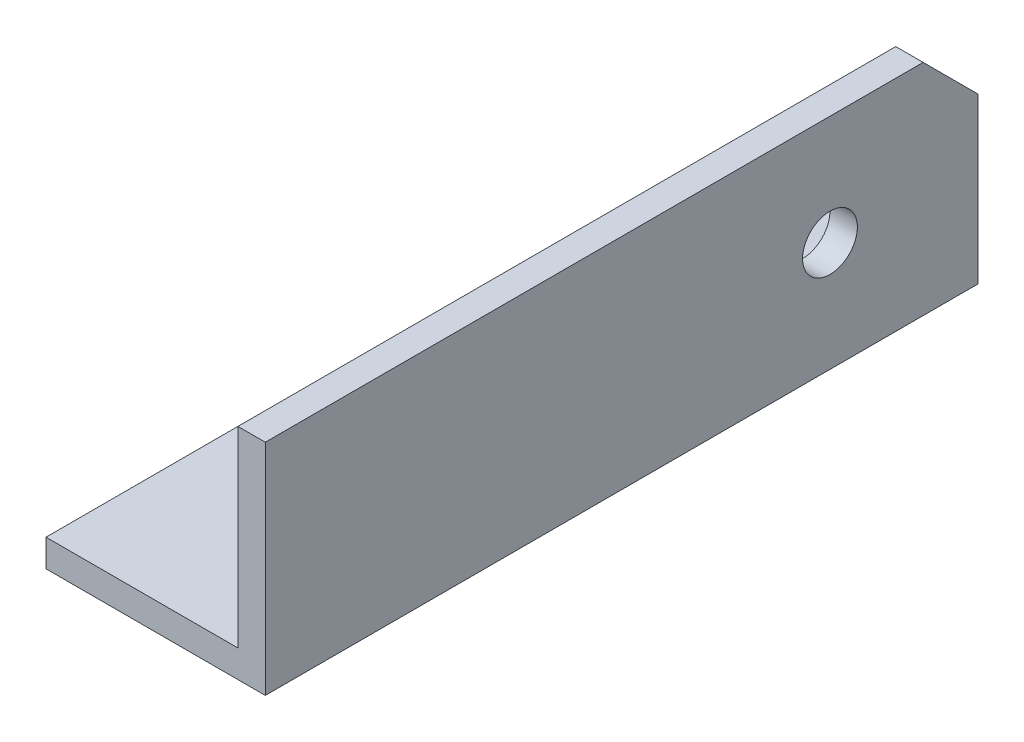
ISO-10303-21;
HEADER;
FILE_DESCRIPTION(('STEP AP214'),'2;1');
FILE_NAME('part.step','',(''),(''),'','','');
FILE_SCHEMA(('AUTOMOTIVE_DESIGN { 1 0 10303 214 1 1 1 1 }'));
ENDSEC;
DATA;
#1=APPLICATION_CONTEXT('core data for automotive mechanical design processes');
#2=APPLICATION_PROTOCOL_DEFINITION('international standard','automotive_design',2000,#1);
#3=PRODUCT_CONTEXT('',#1,'mechanical');
#4=PRODUCT('Part','Part','',(#3));
#5=PRODUCT_RELATED_PRODUCT_CATEGORY('part','',(#4));
#6=PRODUCT_DEFINITION_FORMATION('','',#4);
#7=PRODUCT_DEFINITION_CONTEXT('part definition',#1,'design');
#8=PRODUCT_DEFINITION('design','',#6,#7);
#9=PRODUCT_DEFINITION_SHAPE('','',#8);
#10=(LENGTH_UNIT() NAMED_UNIT(*) SI_UNIT(.MILLI.,.METRE.));
#11=(NAMED_UNIT(*) PLANE_ANGLE_UNIT() SI_UNIT($,.RADIAN.));
#12=(NAMED_UNIT(*) SI_UNIT($,.STERADIAN.) SOLID_ANGLE_UNIT());
#13=UNCERTAINTY_MEASURE_WITH_UNIT(LENGTH_MEASURE(1.E-05),#10,'distance_accuracy_value','');
#14=(GEOMETRIC_REPRESENTATION_CONTEXT(3) GLOBAL_UNCERTAINTY_ASSIGNED_CONTEXT((#13)) GLOBAL_UNIT_ASSIGNED_CONTEXT((#10,
#11,#12)) REPRESENTATION_CONTEXT('',''));
#15=CARTESIAN_POINT('',(0.,0.,0.));
#16=DIRECTION('',(0.,0.,1.));
#17=DIRECTION('',(1.,0.,0.));
#18=AXIS2_PLACEMENT_3D('',#15,#16,#17);
#19=CARTESIAN_POINT('',(0.,0.,-65.));
#20=DIRECTION('',(1.,0.,0.));
#21=DIRECTION('',(0.,0.,-1.));
#22=AXIS2_PLACEMENT_3D('',#19,#20,#21);
#23=PLANE('',#22);
#24=CARTESIAN_POINT('',(0.,20.,-38.));
#25=DIRECTION('',(1.,0.,0.));
#26=DIRECTION('',(0.,0.,-1.));
#27=AXIS2_PLACEMENT_3D('',#24,#25,#26);
#28=CIRCLE('',#27,5.);
#29=CARTESIAN_POINT('',(0.,20.,-43.));
#30=VERTEX_POINT('',#29);
#31=EDGE_CURVE('E112',#30,#30,#28,.T.);
#32=ORIENTED_EDGE('',*,*,#31,.F.);
#33=EDGE_LOOP('',(#32));
#34=FACE_BOUND('',#33,.T.);
#35=DIRECTION('',(0.,1.,0.));
#36=VECTOR('',#35,1.);
#37=CARTESIAN_POINT('',(0.,0.,-65.));
#38=LINE('',#37,#36);
#39=CARTESIAN_POINT('',(0.,0.,-65.));
#40=VERTEX_POINT('',#39);
#41=CARTESIAN_POINT('',(0.,30.,-65.));
#42=VERTEX_POINT('',#41);
#43=EDGE_CURVE('E127',#40,#42,#38,.T.);
#44=ORIENTED_EDGE('',*,*,#43,.T.);
#45=DIRECTION('',(0.,0.707106781186547,0.707106781186548));
#46=VECTOR('',#45,1.);
#47=CARTESIAN_POINT('',(0.,15.,-80.));
#48=LINE('',#47,#46);
#49=CARTESIAN_POINT('',(0.,40.,-55.));
#50=VERTEX_POINT('',#49);
#51=EDGE_CURVE('E55',#42,#50,#48,.T.);
#52=ORIENTED_EDGE('',*,*,#51,.T.);
#53=DIRECTION('',(0.,0.,1.));
#54=VECTOR('',#53,1.);
#55=CARTESIAN_POINT('',(0.,40.,-65.));
#56=LINE('',#55,#54);
#57=CARTESIAN_POINT('',(0.,40.,65.));
#58=VERTEX_POINT('',#57);
#59=EDGE_CURVE('E94',#50,#58,#56,.T.);
#60=ORIENTED_EDGE('',*,*,#59,.T.);
#61=DIRECTION('',(0.,1.,0.));
#62=VECTOR('',#61,1.);
#63=CARTESIAN_POINT('',(0.,0.,65.));
#64=LINE('',#63,#62);
#65=CARTESIAN_POINT('',(0.,0.,65.));
#66=VERTEX_POINT('',#65);
#67=EDGE_CURVE('E97',#66,#58,#64,.T.);
#68=ORIENTED_EDGE('',*,*,#67,.F.);
#69=DIRECTION('',(0.,0.,1.));
#70=VECTOR('',#69,1.);
#71=CARTESIAN_POINT('',(0.,0.,-65.));
#72=LINE('',#71,#70);
#73=EDGE_CURVE('E135',#40,#66,#72,.T.);
#74=ORIENTED_EDGE('',*,*,#73,.F.);
#75=EDGE_LOOP('',(#44,#52,#60,#68,#74));
#76=FACE_BOUND('',#75,.T.);
#77=ADVANCED_FACE('F33',(#34,#76),#23,.T.);
#78=CARTESIAN_POINT('',(-40.,0.,-65.));
#79=DIRECTION('',(0.,-1.,0.));
#80=DIRECTION('',(0.,0.,-1.));
#81=AXIS2_PLACEMENT_3D('',#78,#79,#80);
#82=PLANE('',#81);
#83=DIRECTION('',(0.,0.,1.));
#84=VECTOR('',#83,1.);
#85=CARTESIAN_POINT('',(-40.,0.,-65.));
#86=LINE('',#85,#84);
#87=CARTESIAN_POINT('',(-40.,0.,-55.));
#88=VERTEX_POINT('',#87);
#89=CARTESIAN_POINT('',(-40.,0.,65.));
#90=VERTEX_POINT('',#89);
#91=EDGE_CURVE('E138',#88,#90,#86,.T.);
#92=ORIENTED_EDGE('',*,*,#91,.F.);
#93=DIRECTION('',(0.707106781186547,0.,-0.707106781186548));
#94=VECTOR('',#93,1.);
#95=CARTESIAN_POINT('',(-35.,0.,-60.));
#96=LINE('',#95,#94);
#97=CARTESIAN_POINT('',(-30.,0.,-65.));
#98=VERTEX_POINT('',#97);
#99=EDGE_CURVE('E154',#88,#98,#96,.T.);
#100=ORIENTED_EDGE('',*,*,#99,.T.);
#101=DIRECTION('',(1.,0.,0.));
#102=VECTOR('',#101,1.);
#103=CARTESIAN_POINT('',(-40.,0.,-65.));
#104=LINE('',#103,#102);
#105=EDGE_CURVE('E100',#98,#40,#104,.T.);
#106=ORIENTED_EDGE('',*,*,#105,.T.);
#107=ORIENTED_EDGE('',*,*,#73,.T.);
#108=DIRECTION('',(1.,0.,0.));
#109=VECTOR('',#108,1.);
#110=CARTESIAN_POINT('',(-40.,0.,65.));
#111=LINE('',#110,#109);
#112=EDGE_CURVE('E111',#90,#66,#111,.T.);
#113=ORIENTED_EDGE('',*,*,#112,.F.);
#114=EDGE_LOOP('',(#92,#100,#106,#107,#113));
#115=FACE_BOUND('',#114,.T.);
#116=ADVANCED_FACE('F160',(#115),#82,.T.);
#117=CARTESIAN_POINT('',(-40.,0.,-65.));
#118=DIRECTION('',(1.,0.,0.));
#119=DIRECTION('',(0.,0.,-1.));
#120=AXIS2_PLACEMENT_3D('',#117,#118,#119);
#121=PLANE('',#120);
#122=DIRECTION('',(0.,0.,1.));
#123=VECTOR('',#122,1.);
#124=CARTESIAN_POINT('',(-40.,5.,-65.));
#125=LINE('',#124,#123);
#126=CARTESIAN_POINT('',(-40.,5.,-55.));
#127=VERTEX_POINT('',#126);
#128=CARTESIAN_POINT('',(-40.,5.,65.));
#129=VERTEX_POINT('',#128);
#130=EDGE_CURVE('E140',#127,#129,#125,.T.);
#131=ORIENTED_EDGE('',*,*,#130,.F.);
#132=DIRECTION('',(0.,-1.,0.));
#133=VECTOR('',#132,1.);
#134=CARTESIAN_POINT('',(-40.,0.,-55.));
#135=LINE('',#134,#133);
#136=EDGE_CURVE('E152',#127,#88,#135,.T.);
#137=ORIENTED_EDGE('',*,*,#136,.T.);
#138=ORIENTED_EDGE('',*,*,#91,.T.);
#139=DIRECTION('',(0.,1.,0.));
#140=VECTOR('',#139,1.);
#141=CARTESIAN_POINT('',(-40.,0.,65.));
#142=LINE('',#141,#140);
#143=EDGE_CURVE('E123',#90,#129,#142,.T.);
#144=ORIENTED_EDGE('',*,*,#143,.T.);
#145=EDGE_LOOP('',(#131,#137,#138,#144));
#146=FACE_BOUND('',#145,.T.);
#147=ADVANCED_FACE('F175',(#146),#121,.F.);
#148=CARTESIAN_POINT('',(-40.,5.,-65.));
#149=DIRECTION('',(0.,-1.,0.));
#150=DIRECTION('',(0.,0.,-1.));
#151=AXIS2_PLACEMENT_3D('',#148,#149,#150);
#152=PLANE('',#151);
#153=DIRECTION('',(1.,0.,0.));
#154=VECTOR('',#153,1.);
#155=CARTESIAN_POINT('',(-40.,5.,-65.));
#156=LINE('',#155,#154);
#157=CARTESIAN_POINT('',(-30.,5.,-65.));
#158=VERTEX_POINT('',#157);
#159=CARTESIAN_POINT('',(-5.,5.,-65.));
#160=VERTEX_POINT('',#159);
#161=EDGE_CURVE('E132',#158,#160,#156,.T.);
#162=ORIENTED_EDGE('',*,*,#161,.F.);
#163=DIRECTION('',(-0.707106781186547,0.,0.707106781186548));
#164=VECTOR('',#163,1.);
#165=CARTESIAN_POINT('',(-30.,5.,-65.));
#166=LINE('',#165,#164);
#167=EDGE_CURVE('E150',#158,#127,#166,.T.);
#168=ORIENTED_EDGE('',*,*,#167,.T.);
#169=ORIENTED_EDGE('',*,*,#130,.T.);
#170=DIRECTION('',(1.,0.,0.));
#171=VECTOR('',#170,1.);
#172=CARTESIAN_POINT('',(-40.,5.,65.));
#173=LINE('',#172,#171);
#174=CARTESIAN_POINT('',(-5.,5.,65.));
#175=VERTEX_POINT('',#174);
#176=EDGE_CURVE('E117',#129,#175,#173,.T.);
#177=ORIENTED_EDGE('',*,*,#176,.T.);
#178=DIRECTION('',(0.,0.,1.));
#179=VECTOR('',#178,1.);
#180=CARTESIAN_POINT('',(-5.,5.,-65.));
#181=LINE('',#180,#179);
#182=EDGE_CURVE('E142',#160,#175,#181,.T.);
#183=ORIENTED_EDGE('',*,*,#182,.F.);
#184=EDGE_LOOP('',(#162,#168,#169,#177,#183));
#185=FACE_BOUND('',#184,.T.);
#186=ADVANCED_FACE('F171',(#185),#152,.F.);
#187=CARTESIAN_POINT('',(-5.,0.,-65.));
#188=DIRECTION('',(1.,0.,0.));
#189=DIRECTION('',(0.,0.,-1.));
#190=AXIS2_PLACEMENT_3D('',#187,#188,#189);
#191=PLANE('',#190);
#192=CARTESIAN_POINT('',(-5.,20.,-38.));
#193=DIRECTION('',(-1.,0.,0.));
#194=DIRECTION('',(0.,0.,1.));
#195=AXIS2_PLACEMENT_3D('',#192,#193,#194);
#196=CIRCLE('',#195,5.);
#197=CARTESIAN_POINT('',(-5.,20.,-33.));
#198=VERTEX_POINT('',#197);
#199=EDGE_CURVE('E275',#198,#198,#196,.T.);
#200=ORIENTED_EDGE('',*,*,#199,.F.);
#201=EDGE_LOOP('',(#200));
#202=FACE_BOUND('',#201,.T.);
#203=DIRECTION('',(0.,0.,1.));
#204=VECTOR('',#203,1.);
#205=CARTESIAN_POINT('',(-5.,40.,-65.));
#206=LINE('',#205,#204);
#207=CARTESIAN_POINT('',(-5.,40.,-55.));
#208=VERTEX_POINT('',#207);
#209=CARTESIAN_POINT('',(-5.,40.,65.));
#210=VERTEX_POINT('',#209);
#211=EDGE_CURVE('E99',#208,#210,#206,.T.);
#212=ORIENTED_EDGE('',*,*,#211,.F.);
#213=DIRECTION('',(0.,-0.707106781186547,-0.707106781186548));
#214=VECTOR('',#213,1.);
#215=CARTESIAN_POINT('',(-5.,30.,-65.));
#216=LINE('',#215,#214);
#217=CARTESIAN_POINT('',(-5.,30.,-65.));
#218=VERTEX_POINT('',#217);
#219=EDGE_CURVE('E11',#208,#218,#216,.T.);
#220=ORIENTED_EDGE('',*,*,#219,.T.);
#221=DIRECTION('',(0.,1.,0.));
#222=VECTOR('',#221,1.);
#223=CARTESIAN_POINT('',(-5.,0.,-65.));
#224=LINE('',#223,#222);
#225=EDGE_CURVE('E129',#160,#218,#224,.T.);
#226=ORIENTED_EDGE('',*,*,#225,.F.);
#227=ORIENTED_EDGE('',*,*,#182,.T.);
#228=DIRECTION('',(0.,1.,0.));
#229=VECTOR('',#228,1.);
#230=CARTESIAN_POINT('',(-5.,0.,65.));
#231=LINE('',#230,#229);
#232=EDGE_CURVE('E115',#175,#210,#231,.T.);
#233=ORIENTED_EDGE('',*,*,#232,.T.);
#234=EDGE_LOOP('',(#212,#220,#226,#227,#233));
#235=FACE_BOUND('',#234,.T.);
#236=ADVANCED_FACE('F178',(#202,#235),#191,.F.);
#237=CARTESIAN_POINT('',(-5.,40.,-65.));
#238=DIRECTION('',(0.,-1.,0.));
#239=DIRECTION('',(0.,0.,-1.));
#240=AXIS2_PLACEMENT_3D('',#237,#238,#239);
#241=PLANE('',#240);
#242=ORIENTED_EDGE('',*,*,#59,.F.);
#243=DIRECTION('',(-1.,0.,0.));
#244=VECTOR('',#243,1.);
#245=CARTESIAN_POINT('',(-5.,40.,-55.));
#246=LINE('',#245,#244);
#247=EDGE_CURVE('E41',#50,#208,#246,.T.);
#248=ORIENTED_EDGE('',*,*,#247,.T.);
#249=ORIENTED_EDGE('',*,*,#211,.T.);
#250=DIRECTION('',(1.,0.,0.));
#251=VECTOR('',#250,1.);
#252=CARTESIAN_POINT('',(-5.,40.,65.));
#253=LINE('',#252,#251);
#254=EDGE_CURVE('E107',#210,#58,#253,.T.);
#255=ORIENTED_EDGE('',*,*,#254,.T.);
#256=EDGE_LOOP('',(#242,#248,#249,#255));
#257=FACE_BOUND('',#256,.T.);
#258=ADVANCED_FACE('F114',(#257),#241,.F.);
#259=CARTESIAN_POINT('',(0.,0.,-65.));
#260=DIRECTION('',(0.,0.,-1.));
#261=DIRECTION('',(-1.,0.,0.));
#262=AXIS2_PLACEMENT_3D('',#259,#260,#261);
#263=PLANE('',#262);
#264=ORIENTED_EDGE('',*,*,#105,.F.);
#265=DIRECTION('',(0.,1.,0.));
#266=VECTOR('',#265,1.);
#267=CARTESIAN_POINT('',(-30.,5.,-65.));
#268=LINE('',#267,#266);
#269=EDGE_CURVE('E147',#98,#158,#268,.T.);
#270=ORIENTED_EDGE('',*,*,#269,.T.);
#271=ORIENTED_EDGE('',*,*,#161,.T.);
#272=ORIENTED_EDGE('',*,*,#225,.T.);
#273=DIRECTION('',(1.,0.,0.));
#274=VECTOR('',#273,1.);
#275=CARTESIAN_POINT('',(0.,30.,-65.));
#276=LINE('',#275,#274);
#277=EDGE_CURVE('E137',#218,#42,#276,.T.);
#278=ORIENTED_EDGE('',*,*,#277,.T.);
#279=ORIENTED_EDGE('',*,*,#43,.F.);
#280=EDGE_LOOP('',(#264,#270,#271,#272,#278,#279));
#281=FACE_BOUND('',#280,.T.);
#282=ADVANCED_FACE('F166',(#281),#263,.T.);
#283=CARTESIAN_POINT('',(0.,0.,65.));
#284=DIRECTION('',(0.,0.,-1.));
#285=DIRECTION('',(-1.,0.,0.));
#286=AXIS2_PLACEMENT_3D('',#283,#284,#285);
#287=PLANE('',#286);
#288=ORIENTED_EDGE('',*,*,#67,.T.);
#289=ORIENTED_EDGE('',*,*,#254,.F.);
#290=ORIENTED_EDGE('',*,*,#232,.F.);
#291=ORIENTED_EDGE('',*,*,#176,.F.);
#292=ORIENTED_EDGE('',*,*,#143,.F.);
#293=ORIENTED_EDGE('',*,*,#112,.T.);
#294=EDGE_LOOP('',(#288,#289,#290,#291,#292,#293));
#295=FACE_BOUND('',#294,.T.);
#296=ADVANCED_FACE('F105',(#295),#287,.F.);
#297=CARTESIAN_POINT('',(-30.,0.,-65.));
#298=DIRECTION('',(-0.707106781186548,0.,-0.707106781186547));
#299=DIRECTION('',(0.,-1.,0.));
#300=AXIS2_PLACEMENT_3D('',#297,#298,#299);
#301=PLANE('',#300);
#302=ORIENTED_EDGE('',*,*,#99,.F.);
#303=ORIENTED_EDGE('',*,*,#136,.F.);
#304=ORIENTED_EDGE('',*,*,#167,.F.);
#305=ORIENTED_EDGE('',*,*,#269,.F.);
#306=EDGE_LOOP('',(#302,#303,#304,#305));
#307=FACE_BOUND('',#306,.T.);
#308=ADVANCED_FACE('F168',(#307),#301,.T.);
#309=CARTESIAN_POINT('',(0.,30.,-65.));
#310=DIRECTION('',(0.,0.707106781186548,-0.707106781186547));
#311=DIRECTION('',(-1.,0.,0.));
#312=AXIS2_PLACEMENT_3D('',#309,#310,#311);
#313=PLANE('',#312);
#314=ORIENTED_EDGE('',*,*,#219,.F.);
#315=ORIENTED_EDGE('',*,*,#247,.F.);
#316=ORIENTED_EDGE('',*,*,#51,.F.);
#317=ORIENTED_EDGE('',*,*,#277,.F.);
#318=EDGE_LOOP('',(#314,#315,#316,#317));
#319=FACE_BOUND('',#318,.T.);
#320=ADVANCED_FACE('F35',(#319),#313,.T.);
#321=CARTESIAN_POINT('',(5.,20.,-38.));
#322=DIRECTION('',(-1.,0.,0.));
#323=DIRECTION('',(0.,0.,1.));
#324=AXIS2_PLACEMENT_3D('',#321,#322,#323);
#325=CYLINDRICAL_SURFACE('',#324,5.);
#326=ORIENTED_EDGE('',*,*,#31,.T.);
#327=EDGE_LOOP('',(#326));
#328=FACE_BOUND('',#327,.T.);
#329=ORIENTED_EDGE('',*,*,#199,.T.);
#330=EDGE_LOOP('',(#329));
#331=FACE_BOUND('',#330,.T.);
#332=ADVANCED_FACE('F183',(#328,#331),#325,.F.);
#333=CLOSED_SHELL('',(#77,#116,#147,#186,#236,#258,#282,#296,#308,#320,#332));
#334=MANIFOLD_SOLID_BREP('B2',#333);
#335=ADVANCED_BREP_SHAPE_REPRESENTATION('',(#18,#334),#14);
#336=SHAPE_DEFINITION_REPRESENTATION(#9,#335);
ENDSEC;
END-ISO-10303-21;
